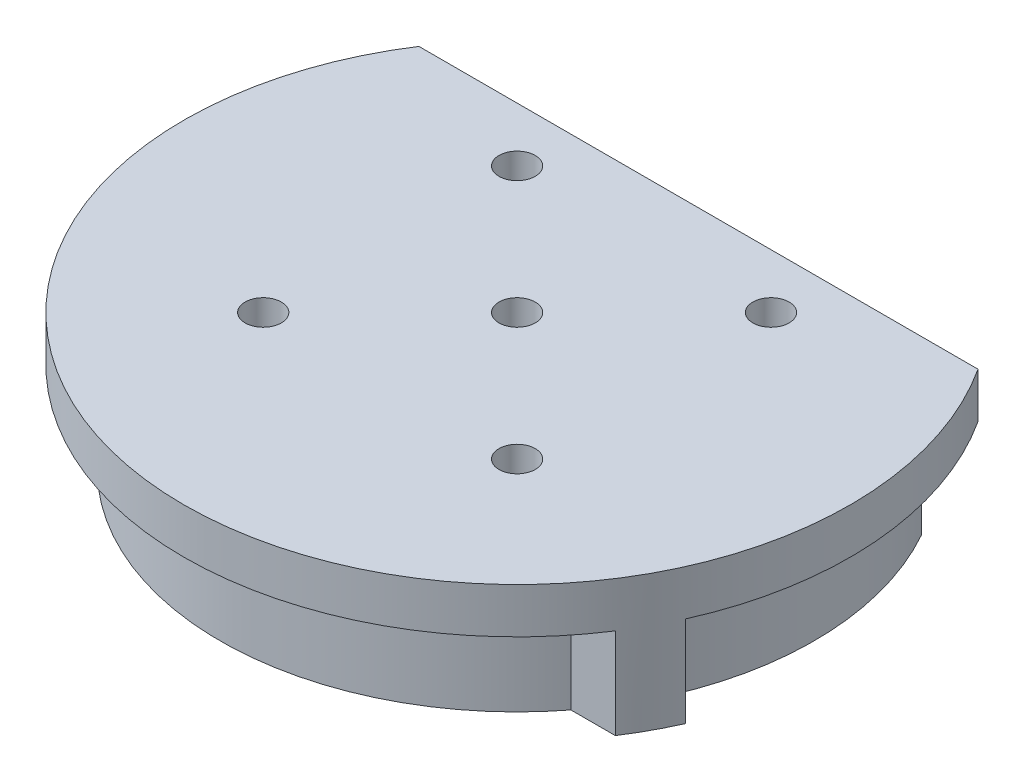
ISO-10303-21;
HEADER;
FILE_DESCRIPTION(('STEP AP214'),'2;1');
FILE_NAME('part.step','',(''),(''),'','','');
FILE_SCHEMA(('AUTOMOTIVE_DESIGN { 1 0 10303 214 1 1 1 1 }'));
ENDSEC;
DATA;
#1=APPLICATION_CONTEXT('core data for automotive mechanical design processes');
#2=APPLICATION_PROTOCOL_DEFINITION('international standard','automotive_design',2000,#1);
#3=PRODUCT_CONTEXT('',#1,'mechanical');
#4=PRODUCT('Part','Part','',(#3));
#5=PRODUCT_RELATED_PRODUCT_CATEGORY('part','',(#4));
#6=PRODUCT_DEFINITION_FORMATION('','',#4);
#7=PRODUCT_DEFINITION_CONTEXT('part definition',#1,'design');
#8=PRODUCT_DEFINITION('design','',#6,#7);
#9=PRODUCT_DEFINITION_SHAPE('','',#8);
#10=(LENGTH_UNIT() NAMED_UNIT(*) SI_UNIT(.MILLI.,.METRE.));
#11=(NAMED_UNIT(*) PLANE_ANGLE_UNIT() SI_UNIT($,.RADIAN.));
#12=(NAMED_UNIT(*) SI_UNIT($,.STERADIAN.) SOLID_ANGLE_UNIT());
#13=UNCERTAINTY_MEASURE_WITH_UNIT(LENGTH_MEASURE(1.E-05),#10,'distance_accuracy_value','');
#14=(GEOMETRIC_REPRESENTATION_CONTEXT(3) GLOBAL_UNCERTAINTY_ASSIGNED_CONTEXT((#13)) GLOBAL_UNIT_ASSIGNED_CONTEXT((#10,
#11,#12)) REPRESENTATION_CONTEXT('',''));
#15=CARTESIAN_POINT('',(0.,0.,0.));
#16=DIRECTION('',(0.,0.,1.));
#17=DIRECTION('',(1.,0.,0.));
#18=AXIS2_PLACEMENT_3D('',#15,#16,#17);
#19=CARTESIAN_POINT('',(0.,0.,0.));
#20=DIRECTION('',(0.,1.,0.));
#21=DIRECTION('',(0.,0.,1.));
#22=AXIS2_PLACEMENT_3D('',#19,#20,#21);
#23=PLANE('',#22);
#24=CARTESIAN_POINT('',(14.,0.,-14.));
#25=DIRECTION('',(0.,1.,0.));
#26=DIRECTION('',(0.,0.,1.));
#27=AXIS2_PLACEMENT_3D('',#24,#25,#26);
#28=CIRCLE('',#27,2.);
#29=CARTESIAN_POINT('',(14.,0.,-12.));
#30=VERTEX_POINT('',#29);
#31=EDGE_CURVE('E528',#30,#30,#28,.T.);
#32=ORIENTED_EDGE('',*,*,#31,.T.);
#33=EDGE_LOOP('',(#32));
#34=FACE_BOUND('',#33,.T.);
#35=CARTESIAN_POINT('',(-14.,0.,-14.));
#36=DIRECTION('',(0.,1.,0.));
#37=DIRECTION('',(0.,0.,1.));
#38=AXIS2_PLACEMENT_3D('',#35,#36,#37);
#39=CIRCLE('',#38,2.);
#40=CARTESIAN_POINT('',(-14.,0.,-12.));
#41=VERTEX_POINT('',#40);
#42=EDGE_CURVE('E532',#41,#41,#39,.T.);
#43=ORIENTED_EDGE('',*,*,#42,.T.);
#44=EDGE_LOOP('',(#43));
#45=FACE_BOUND('',#44,.T.);
#46=CARTESIAN_POINT('',(-14.,0.,14.));
#47=DIRECTION('',(0.,1.,0.));
#48=DIRECTION('',(0.,0.,1.));
#49=AXIS2_PLACEMENT_3D('',#46,#47,#48);
#50=CIRCLE('',#49,2.);
#51=CARTESIAN_POINT('',(-14.,0.,16.));
#52=VERTEX_POINT('',#51);
#53=EDGE_CURVE('E541',#52,#52,#50,.T.);
#54=ORIENTED_EDGE('',*,*,#53,.T.);
#55=EDGE_LOOP('',(#54));
#56=FACE_BOUND('',#55,.T.);
#57=CARTESIAN_POINT('',(14.,0.,14.));
#58=DIRECTION('',(0.,1.,0.));
#59=DIRECTION('',(0.,0.,1.));
#60=AXIS2_PLACEMENT_3D('',#57,#58,#59);
#61=CIRCLE('',#60,2.);
#62=CARTESIAN_POINT('',(14.,0.,16.));
#63=VERTEX_POINT('',#62);
#64=EDGE_CURVE('E169',#63,#63,#61,.T.);
#65=ORIENTED_EDGE('',*,*,#64,.T.);
#66=EDGE_LOOP('',(#65));
#67=FACE_BOUND('',#66,.T.);
#68=CARTESIAN_POINT('',(0.,0.,0.));
#69=DIRECTION('',(0.,1.,0.));
#70=DIRECTION('',(0.,0.,1.));
#71=AXIS2_PLACEMENT_3D('',#68,#69,#70);
#72=CIRCLE('',#71,7.5);
#73=CARTESIAN_POINT('',(0.,0.,7.5));
#74=VERTEX_POINT('',#73);
#75=EDGE_CURVE('E237',#74,#74,#72,.F.);
#76=ORIENTED_EDGE('',*,*,#75,.F.);
#77=EDGE_LOOP('',(#76));
#78=FACE_BOUND('',#77,.T.);
#79=DIRECTION('',(1.,0.,0.));
#80=VECTOR('',#79,1.);
#81=CARTESIAN_POINT('',(33.5494038695176,0.,15.));
#82=LINE('',#81,#80);
#83=CARTESIAN_POINT('',(29.1129266821459,0.,15.));
#84=VERTEX_POINT('',#83);
#85=CARTESIAN_POINT('',(33.5494038695176,0.,15.));
#86=VERTEX_POINT('',#85);
#87=EDGE_CURVE('E49',#84,#86,#82,.T.);
#88=ORIENTED_EDGE('',*,*,#87,.F.);
#89=CARTESIAN_POINT('',(0.,0.,0.));
#90=DIRECTION('',(0.,1.,0.));
#91=DIRECTION('',(0.,0.,1.));
#92=AXIS2_PLACEMENT_3D('',#89,#90,#91);
#93=CIRCLE('',#92,32.75);
#94=CARTESIAN_POINT('',(28.5755577373391,0.,-16.));
#95=VERTEX_POINT('',#94);
#96=EDGE_CURVE('E153',#84,#95,#93,.T.);
#97=ORIENTED_EDGE('',*,*,#96,.T.);
#98=DIRECTION('',(-1.,0.,0.));
#99=VECTOR('',#98,1.);
#100=CARTESIAN_POINT('',(28.5755577373391,0.,-16.));
#101=LINE('',#100,#99);
#102=CARTESIAN_POINT('',(23.8864501339148,0.,-16.));
#103=VERTEX_POINT('',#102);
#104=EDGE_CURVE('E203',#95,#103,#101,.T.);
#105=ORIENTED_EDGE('',*,*,#104,.T.);
#106=CARTESIAN_POINT('',(0.,0.,0.));
#107=DIRECTION('',(0.,1.,0.));
#108=DIRECTION('',(0.,0.,1.));
#109=AXIS2_PLACEMENT_3D('',#106,#107,#108);
#110=CIRCLE('',#109,28.75);
#111=CARTESIAN_POINT('',(-23.8864501339148,0.,-16.));
#112=VERTEX_POINT('',#111);
#113=EDGE_CURVE('E11',#112,#103,#110,.T.);
#114=ORIENTED_EDGE('',*,*,#113,.F.);
#115=DIRECTION('',(-1.,0.,0.));
#116=VECTOR('',#115,1.);
#117=CARTESIAN_POINT('',(-28.5755577373391,0.,-16.));
#118=LINE('',#117,#116);
#119=CARTESIAN_POINT('',(-28.5755577373391,0.,-16.));
#120=VERTEX_POINT('',#119);
#121=EDGE_CURVE('E213',#112,#120,#118,.T.);
#122=ORIENTED_EDGE('',*,*,#121,.T.);
#123=CARTESIAN_POINT('',(-29.1129266821459,0.,15.));
#124=VERTEX_POINT('',#123);
#125=EDGE_CURVE('E37',#120,#124,#93,.T.);
#126=ORIENTED_EDGE('',*,*,#125,.T.);
#127=DIRECTION('',(1.,0.,0.));
#128=VECTOR('',#127,1.);
#129=CARTESIAN_POINT('',(-33.5494038695176,0.,15.));
#130=LINE('',#129,#128);
#131=CARTESIAN_POINT('',(-33.5494038695176,0.,15.));
#132=VERTEX_POINT('',#131);
#133=EDGE_CURVE('E183',#132,#124,#130,.T.);
#134=ORIENTED_EDGE('',*,*,#133,.F.);
#135=CARTESIAN_POINT('',(0.,0.,0.));
#136=DIRECTION('',(0.,1.,0.));
#137=DIRECTION('',(0.,0.,1.));
#138=AXIS2_PLACEMENT_3D('',#135,#136,#137);
#139=CIRCLE('',#138,36.75);
#140=CARTESIAN_POINT('',(-30.8311936194498,0.,-20.));
#141=VERTEX_POINT('',#140);
#142=EDGE_CURVE('E238',#141,#132,#139,.T.);
#143=ORIENTED_EDGE('',*,*,#142,.F.);
#144=DIRECTION('',(-1.,0.,0.));
#145=VECTOR('',#144,1.);
#146=CARTESIAN_POINT('',(0.,0.,-20.));
#147=LINE('',#146,#145);
#148=CARTESIAN_POINT('',(30.8311936194498,0.,-20.));
#149=VERTEX_POINT('',#148);
#150=EDGE_CURVE('E228',#149,#141,#147,.T.);
#151=ORIENTED_EDGE('',*,*,#150,.F.);
#152=EDGE_CURVE('E242',#86,#149,#139,.T.);
#153=ORIENTED_EDGE('',*,*,#152,.F.);
#154=EDGE_LOOP('',(#88,#97,#105,#114,#122,#126,#134,#143,#151,#153));
#155=FACE_BOUND('',#154,.T.);
#156=ADVANCED_FACE('F33',(#34,#45,#56,#67,#78,#155),#23,.F.);
#157=DIRECTION('',(-1.,0.,0.));
#158=VECTOR('',#157,1.);
#159=CARTESIAN_POINT('',(30.8311936194498,0.,20.));
#160=LINE('',#159,#158);
#161=CARTESIAN_POINT('',(30.8311936194498,0.,20.));
#162=VERTEX_POINT('',#161);
#163=CARTESIAN_POINT('',(25.9338099784818,0.,20.));
#164=VERTEX_POINT('',#163);
#165=EDGE_CURVE('E162',#162,#164,#160,.T.);
#166=ORIENTED_EDGE('',*,*,#165,.F.);
#167=CARTESIAN_POINT('',(-30.8311936194498,0.,20.));
#168=VERTEX_POINT('',#167);
#169=EDGE_CURVE('E241',#168,#162,#139,.T.);
#170=ORIENTED_EDGE('',*,*,#169,.F.);
#171=DIRECTION('',(-1.,0.,0.));
#172=VECTOR('',#171,1.);
#173=CARTESIAN_POINT('',(-30.8311936194498,0.,20.));
#174=LINE('',#173,#172);
#175=CARTESIAN_POINT('',(-25.9338099784818,0.,20.));
#176=VERTEX_POINT('',#175);
#177=EDGE_CURVE('E155',#176,#168,#174,.T.);
#178=ORIENTED_EDGE('',*,*,#177,.F.);
#179=EDGE_CURVE('E317',#176,#164,#93,.T.);
#180=ORIENTED_EDGE('',*,*,#179,.T.);
#181=EDGE_LOOP('',(#166,#170,#178,#180));
#182=FACE_BOUND('',#181,.T.);
#183=ADVANCED_FACE('F256',(#182),#23,.F.);
#184=CARTESIAN_POINT('',(0.,-10.,0.));
#185=DIRECTION('',(0.,1.,0.));
#186=DIRECTION('',(0.,0.,1.));
#187=AXIS2_PLACEMENT_3D('',#184,#185,#186);
#188=CYLINDRICAL_SURFACE('',#187,32.75);
#189=ORIENTED_EDGE('',*,*,#96,.F.);
#190=DIRECTION('',(0.,1.,0.));
#191=VECTOR('',#190,1.);
#192=CARTESIAN_POINT('',(29.1129266821459,-10.,15.));
#193=LINE('',#192,#191);
#194=CARTESIAN_POINT('',(29.1129266821459,-10.,15.));
#195=VERTEX_POINT('',#194);
#196=EDGE_CURVE('E151',#195,#84,#193,.T.);
#197=ORIENTED_EDGE('',*,*,#196,.F.);
#198=CARTESIAN_POINT('',(0.,-10.,0.));
#199=DIRECTION('',(0.,1.,0.));
#200=DIRECTION('',(0.,0.,1.));
#201=AXIS2_PLACEMENT_3D('',#198,#199,#200);
#202=CIRCLE('',#201,32.75);
#203=CARTESIAN_POINT('',(28.5755577373391,-10.,-16.));
#204=VERTEX_POINT('',#203);
#205=EDGE_CURVE('E135',#195,#204,#202,.T.);
#206=ORIENTED_EDGE('',*,*,#205,.T.);
#207=DIRECTION('',(0.,-1.,0.));
#208=VECTOR('',#207,1.);
#209=CARTESIAN_POINT('',(28.5755577373391,0.,-16.));
#210=LINE('',#209,#208);
#211=EDGE_CURVE('E206',#95,#204,#210,.T.);
#212=ORIENTED_EDGE('',*,*,#211,.F.);
#213=EDGE_LOOP('',(#189,#197,#206,#212));
#214=FACE_BOUND('',#213,.T.);
#215=ADVANCED_FACE('F152',(#214),#188,.T.);
#216=CARTESIAN_POINT('',(-25.9338099784818,-10.,20.));
#217=VERTEX_POINT('',#216);
#218=CARTESIAN_POINT('',(25.9338099784818,-10.,20.));
#219=VERTEX_POINT('',#218);
#220=EDGE_CURVE('E146',#217,#219,#202,.T.);
#221=ORIENTED_EDGE('',*,*,#220,.T.);
#222=DIRECTION('',(0.,1.,0.));
#223=VECTOR('',#222,1.);
#224=CARTESIAN_POINT('',(25.9338099784818,-10.,20.));
#225=LINE('',#224,#223);
#226=EDGE_CURVE('E57',#219,#164,#225,.T.);
#227=ORIENTED_EDGE('',*,*,#226,.T.);
#228=ORIENTED_EDGE('',*,*,#179,.F.);
#229=DIRECTION('',(0.,1.,0.));
#230=VECTOR('',#229,1.);
#231=CARTESIAN_POINT('',(-25.9338099784818,-10.,20.));
#232=LINE('',#231,#230);
#233=EDGE_CURVE('E200',#217,#176,#232,.T.);
#234=ORIENTED_EDGE('',*,*,#233,.F.);
#235=EDGE_LOOP('',(#221,#227,#228,#234));
#236=FACE_BOUND('',#235,.T.);
#237=ADVANCED_FACE('F318',(#236),#188,.T.);
#238=CARTESIAN_POINT('',(-28.5755577373391,-10.,-16.));
#239=VERTEX_POINT('',#238);
#240=CARTESIAN_POINT('',(-29.1129266821459,-10.,15.));
#241=VERTEX_POINT('',#240);
#242=EDGE_CURVE('E149',#239,#241,#202,.T.);
#243=ORIENTED_EDGE('',*,*,#242,.T.);
#244=DIRECTION('',(0.,1.,0.));
#245=VECTOR('',#244,1.);
#246=CARTESIAN_POINT('',(-29.1129266821459,-10.,15.));
#247=LINE('',#246,#245);
#248=EDGE_CURVE('E188',#241,#124,#247,.T.);
#249=ORIENTED_EDGE('',*,*,#248,.T.);
#250=ORIENTED_EDGE('',*,*,#125,.F.);
#251=DIRECTION('',(0.,-1.,0.));
#252=VECTOR('',#251,1.);
#253=CARTESIAN_POINT('',(-28.5755577373391,0.,-16.));
#254=LINE('',#253,#252);
#255=EDGE_CURVE('E215',#120,#239,#254,.T.);
#256=ORIENTED_EDGE('',*,*,#255,.T.);
#257=EDGE_LOOP('',(#243,#249,#250,#256));
#258=FACE_BOUND('',#257,.T.);
#259=ADVANCED_FACE('F329',(#258),#188,.T.);
#260=CARTESIAN_POINT('',(-30.8311936194498,10.,-20.));
#261=DIRECTION('',(0.,0.,-1.));
#262=DIRECTION('',(-1.,0.,0.));
#263=AXIS2_PLACEMENT_3D('',#260,#261,#262);
#264=PLANE('',#263);
#265=DIRECTION('',(0.,-1.,0.));
#266=VECTOR('',#265,1.);
#267=CARTESIAN_POINT('',(30.8311936194498,10.,-20.));
#268=LINE('',#267,#266);
#269=CARTESIAN_POINT('',(30.8311936194498,5.,-20.));
#270=VERTEX_POINT('',#269);
#271=EDGE_CURVE('E222',#270,#149,#268,.T.);
#272=ORIENTED_EDGE('',*,*,#271,.T.);
#273=ORIENTED_EDGE('',*,*,#150,.T.);
#274=DIRECTION('',(0.,-1.,0.));
#275=VECTOR('',#274,1.);
#276=CARTESIAN_POINT('',(-30.8311936194498,10.,-20.));
#277=LINE('',#276,#275);
#278=CARTESIAN_POINT('',(-30.8311936194498,5.,-20.));
#279=VERTEX_POINT('',#278);
#280=EDGE_CURVE('E225',#279,#141,#277,.T.);
#281=ORIENTED_EDGE('',*,*,#280,.F.);
#282=DIRECTION('',(-1.,0.,0.));
#283=VECTOR('',#282,1.);
#284=CARTESIAN_POINT('',(0.,5.,-20.));
#285=LINE('',#284,#283);
#286=EDGE_CURVE('E230',#270,#279,#285,.T.);
#287=ORIENTED_EDGE('',*,*,#286,.F.);
#288=EDGE_LOOP('',(#272,#273,#281,#287));
#289=FACE_BOUND('',#288,.T.);
#290=ADVANCED_FACE('F276',(#289),#264,.T.);
#291=CARTESIAN_POINT('',(0.,5.,0.));
#292=DIRECTION('',(0.,1.,0.));
#293=DIRECTION('',(0.,0.,1.));
#294=AXIS2_PLACEMENT_3D('',#291,#292,#293);
#295=PLANE('',#294);
#296=CARTESIAN_POINT('',(14.,5.,-14.));
#297=DIRECTION('',(0.,1.,0.));
#298=DIRECTION('',(0.,0.,1.));
#299=AXIS2_PLACEMENT_3D('',#296,#297,#298);
#300=CIRCLE('',#299,2.);
#301=CARTESIAN_POINT('',(14.,5.,-12.));
#302=VERTEX_POINT('',#301);
#303=EDGE_CURVE('E526',#302,#302,#300,.T.);
#304=ORIENTED_EDGE('',*,*,#303,.F.);
#305=EDGE_LOOP('',(#304));
#306=FACE_BOUND('',#305,.T.);
#307=CARTESIAN_POINT('',(-14.,5.,-14.));
#308=DIRECTION('',(0.,1.,0.));
#309=DIRECTION('',(0.,0.,1.));
#310=AXIS2_PLACEMENT_3D('',#307,#308,#309);
#311=CIRCLE('',#310,2.);
#312=CARTESIAN_POINT('',(-14.,5.,-12.));
#313=VERTEX_POINT('',#312);
#314=EDGE_CURVE('E529',#313,#313,#311,.T.);
#315=ORIENTED_EDGE('',*,*,#314,.F.);
#316=EDGE_LOOP('',(#315));
#317=FACE_BOUND('',#316,.T.);
#318=CARTESIAN_POINT('',(-14.,5.,14.));
#319=DIRECTION('',(0.,1.,0.));
#320=DIRECTION('',(0.,0.,1.));
#321=AXIS2_PLACEMENT_3D('',#318,#319,#320);
#322=CIRCLE('',#321,2.);
#323=CARTESIAN_POINT('',(-14.,5.,16.));
#324=VERTEX_POINT('',#323);
#325=EDGE_CURVE('E538',#324,#324,#322,.T.);
#326=ORIENTED_EDGE('',*,*,#325,.F.);
#327=EDGE_LOOP('',(#326));
#328=FACE_BOUND('',#327,.T.);
#329=CARTESIAN_POINT('',(14.,5.,14.));
#330=DIRECTION('',(0.,1.,0.));
#331=DIRECTION('',(0.,0.,1.));
#332=AXIS2_PLACEMENT_3D('',#329,#330,#331);
#333=CIRCLE('',#332,2.);
#334=CARTESIAN_POINT('',(14.,5.,16.));
#335=VERTEX_POINT('',#334);
#336=EDGE_CURVE('E543',#335,#335,#333,.T.);
#337=ORIENTED_EDGE('',*,*,#336,.F.);
#338=EDGE_LOOP('',(#337));
#339=FACE_BOUND('',#338,.T.);
#340=CARTESIAN_POINT('',(0.,5.,0.));
#341=DIRECTION('',(0.,1.,0.));
#342=DIRECTION('',(0.,0.,1.));
#343=AXIS2_PLACEMENT_3D('',#340,#341,#342);
#344=CIRCLE('',#343,2.);
#345=CARTESIAN_POINT('',(0.,5.,2.));
#346=VERTEX_POINT('',#345);
#347=EDGE_CURVE('E243',#346,#346,#344,.T.);
#348=ORIENTED_EDGE('',*,*,#347,.F.);
#349=EDGE_LOOP('',(#348));
#350=FACE_BOUND('',#349,.T.);
#351=CARTESIAN_POINT('',(0.,5.,0.));
#352=DIRECTION('',(0.,1.,0.));
#353=DIRECTION('',(0.,0.,1.));
#354=AXIS2_PLACEMENT_3D('',#351,#352,#353);
#355=CIRCLE('',#354,36.75);
#356=EDGE_CURVE('E234',#279,#270,#355,.T.);
#357=ORIENTED_EDGE('',*,*,#356,.T.);
#358=ORIENTED_EDGE('',*,*,#286,.T.);
#359=EDGE_LOOP('',(#357,#358));
#360=FACE_BOUND('',#359,.T.);
#361=ADVANCED_FACE('F272',(#306,#317,#328,#339,#350,#360),#295,.T.);
#362=CARTESIAN_POINT('',(0.,5.,0.));
#363=DIRECTION('',(0.,-1.,0.));
#364=DIRECTION('',(0.,0.,-1.));
#365=AXIS2_PLACEMENT_3D('',#362,#363,#364);
#366=CYLINDRICAL_SURFACE('',#365,36.75);
#367=ORIENTED_EDGE('',*,*,#280,.T.);
#368=ORIENTED_EDGE('',*,*,#142,.T.);
#369=DIRECTION('',(0.,1.,0.));
#370=VECTOR('',#369,1.);
#371=CARTESIAN_POINT('',(-33.5494038695176,-10.,15.));
#372=LINE('',#371,#370);
#373=CARTESIAN_POINT('',(-33.5494038695176,-10.,15.));
#374=VERTEX_POINT('',#373);
#375=EDGE_CURVE('E194',#374,#132,#372,.T.);
#376=ORIENTED_EDGE('',*,*,#375,.F.);
#377=CARTESIAN_POINT('',(0.,-10.,0.));
#378=DIRECTION('',(0.,-1.,0.));
#379=DIRECTION('',(0.,0.,1.));
#380=AXIS2_PLACEMENT_3D('',#377,#378,#379);
#381=CIRCLE('',#380,36.75);
#382=CARTESIAN_POINT('',(-30.8311936194498,-10.,20.));
#383=VERTEX_POINT('',#382);
#384=EDGE_CURVE('E182',#383,#374,#381,.T.);
#385=ORIENTED_EDGE('',*,*,#384,.F.);
#386=DIRECTION('',(0.,1.,0.));
#387=VECTOR('',#386,1.);
#388=CARTESIAN_POINT('',(-30.8311936194498,-10.,20.));
#389=LINE('',#388,#387);
#390=EDGE_CURVE('E197',#383,#168,#389,.T.);
#391=ORIENTED_EDGE('',*,*,#390,.T.);
#392=ORIENTED_EDGE('',*,*,#169,.T.);
#393=DIRECTION('',(0.,1.,0.));
#394=VECTOR('',#393,1.);
#395=CARTESIAN_POINT('',(30.8311936194498,-10.,20.));
#396=LINE('',#395,#394);
#397=CARTESIAN_POINT('',(30.8311936194498,-10.,20.));
#398=VERTEX_POINT('',#397);
#399=EDGE_CURVE('E176',#398,#162,#396,.T.);
#400=ORIENTED_EDGE('',*,*,#399,.F.);
#401=CARTESIAN_POINT('',(0.,-10.,0.));
#402=DIRECTION('',(0.,-1.,0.));
#403=DIRECTION('',(0.,0.,-1.));
#404=AXIS2_PLACEMENT_3D('',#401,#402,#403);
#405=CIRCLE('',#404,36.75);
#406=CARTESIAN_POINT('',(33.5494038695176,-10.,15.));
#407=VERTEX_POINT('',#406);
#408=EDGE_CURVE('E161',#407,#398,#405,.T.);
#409=ORIENTED_EDGE('',*,*,#408,.F.);
#410=DIRECTION('',(0.,1.,0.));
#411=VECTOR('',#410,1.);
#412=CARTESIAN_POINT('',(33.5494038695176,-10.,15.));
#413=LINE('',#412,#411);
#414=EDGE_CURVE('E156',#407,#86,#413,.T.);
#415=ORIENTED_EDGE('',*,*,#414,.T.);
#416=ORIENTED_EDGE('',*,*,#152,.T.);
#417=ORIENTED_EDGE('',*,*,#271,.F.);
#418=ORIENTED_EDGE('',*,*,#356,.F.);
#419=EDGE_LOOP('',(#367,#368,#376,#385,#391,#392,#400,#409,#415,#416,#417,#418));
#420=FACE_BOUND('',#419,.T.);
#421=ADVANCED_FACE('F268',(#420),#366,.T.);
#422=CARTESIAN_POINT('',(0.,-10.,0.));
#423=DIRECTION('',(0.,1.,0.));
#424=DIRECTION('',(0.,0.,1.));
#425=AXIS2_PLACEMENT_3D('',#422,#423,#424);
#426=CYLINDRICAL_SURFACE('',#425,28.75);
#427=ORIENTED_EDGE('',*,*,#113,.T.);
#428=DIRECTION('',(0.,1.,0.));
#429=VECTOR('',#428,1.);
#430=CARTESIAN_POINT('',(23.8864501339148,-10.,-16.));
#431=LINE('',#430,#429);
#432=CARTESIAN_POINT('',(23.8864501339148,-10.,-16.));
#433=VERTEX_POINT('',#432);
#434=EDGE_CURVE('E209',#103,#433,#431,.F.);
#435=ORIENTED_EDGE('',*,*,#434,.T.);
#436=CARTESIAN_POINT('',(0.,-10.,0.));
#437=DIRECTION('',(0.,1.,0.));
#438=DIRECTION('',(0.,0.,1.));
#439=AXIS2_PLACEMENT_3D('',#436,#437,#438);
#440=CIRCLE('',#439,28.75);
#441=CARTESIAN_POINT('',(-23.8864501339148,-10.,-16.));
#442=VERTEX_POINT('',#441);
#443=EDGE_CURVE('E147',#442,#433,#440,.T.);
#444=ORIENTED_EDGE('',*,*,#443,.F.);
#445=DIRECTION('',(0.,1.,0.));
#446=VECTOR('',#445,1.);
#447=CARTESIAN_POINT('',(-23.8864501339148,-10.,-16.));
#448=LINE('',#447,#446);
#449=EDGE_CURVE('E219',#442,#112,#448,.T.);
#450=ORIENTED_EDGE('',*,*,#449,.T.);
#451=EDGE_LOOP('',(#427,#435,#444,#450));
#452=FACE_BOUND('',#451,.T.);
#453=ADVANCED_FACE('F271',(#452),#426,.F.);
#454=CARTESIAN_POINT('',(0.,-10.,0.));
#455=DIRECTION('',(0.,1.,0.));
#456=DIRECTION('',(0.,0.,1.));
#457=AXIS2_PLACEMENT_3D('',#454,#455,#456);
#458=PLANE('',#457);
#459=ORIENTED_EDGE('',*,*,#443,.T.);
#460=DIRECTION('',(-1.,0.,0.));
#461=VECTOR('',#460,1.);
#462=CARTESIAN_POINT('',(28.5755577373391,-10.,-16.));
#463=LINE('',#462,#461);
#464=EDGE_CURVE('E142',#204,#433,#463,.T.);
#465=ORIENTED_EDGE('',*,*,#464,.F.);
#466=ORIENTED_EDGE('',*,*,#205,.F.);
#467=DIRECTION('',(1.,0.,0.));
#468=VECTOR('',#467,1.);
#469=CARTESIAN_POINT('',(33.5494038695176,-10.,15.));
#470=LINE('',#469,#468);
#471=EDGE_CURVE('E140',#195,#407,#470,.T.);
#472=ORIENTED_EDGE('',*,*,#471,.T.);
#473=ORIENTED_EDGE('',*,*,#408,.T.);
#474=DIRECTION('',(-1.,0.,0.));
#475=VECTOR('',#474,1.);
#476=CARTESIAN_POINT('',(30.8311936194498,-10.,20.));
#477=LINE('',#476,#475);
#478=EDGE_CURVE('E164',#398,#219,#477,.T.);
#479=ORIENTED_EDGE('',*,*,#478,.T.);
#480=ORIENTED_EDGE('',*,*,#220,.F.);
#481=DIRECTION('',(-1.,0.,0.));
#482=VECTOR('',#481,1.);
#483=CARTESIAN_POINT('',(-30.8311936194498,-10.,20.));
#484=LINE('',#483,#482);
#485=EDGE_CURVE('E180',#217,#383,#484,.T.);
#486=ORIENTED_EDGE('',*,*,#485,.T.);
#487=ORIENTED_EDGE('',*,*,#384,.T.);
#488=DIRECTION('',(1.,0.,0.));
#489=VECTOR('',#488,1.);
#490=CARTESIAN_POINT('',(-33.5494038695176,-10.,15.));
#491=LINE('',#490,#489);
#492=EDGE_CURVE('E185',#374,#241,#491,.T.);
#493=ORIENTED_EDGE('',*,*,#492,.T.);
#494=ORIENTED_EDGE('',*,*,#242,.F.);
#495=DIRECTION('',(-1.,0.,0.));
#496=VECTOR('',#495,1.);
#497=CARTESIAN_POINT('',(-28.5755577373391,-10.,-16.));
#498=LINE('',#497,#496);
#499=EDGE_CURVE('E212',#442,#239,#498,.T.);
#500=ORIENTED_EDGE('',*,*,#499,.F.);
#501=EDGE_LOOP('',(#459,#465,#466,#472,#473,#479,#480,#486,#487,#493,#494,#500));
#502=FACE_BOUND('',#501,.T.);
#503=ADVANCED_FACE('F138',(#502),#458,.F.);
#504=CARTESIAN_POINT('',(0.,-10.,0.));
#505=DIRECTION('',(0.,1.,0.));
#506=DIRECTION('',(0.,0.,1.));
#507=AXIS2_PLACEMENT_3D('',#504,#505,#506);
#508=CYLINDRICAL_SURFACE('',#507,7.5);
#509=CARTESIAN_POINT('',(0.,-10.,0.));
#510=DIRECTION('',(0.,1.,0.));
#511=DIRECTION('',(0.,0.,1.));
#512=AXIS2_PLACEMENT_3D('',#509,#510,#511);
#513=CIRCLE('',#512,7.5);
#514=CARTESIAN_POINT('',(0.,-10.,7.5));
#515=VERTEX_POINT('',#514);
#516=EDGE_CURVE('E42',#515,#515,#513,.T.);
#517=ORIENTED_EDGE('',*,*,#516,.T.);
#518=EDGE_LOOP('',(#517));
#519=FACE_BOUND('',#518,.T.);
#520=ORIENTED_EDGE('',*,*,#75,.T.);
#521=EDGE_LOOP('',(#520));
#522=FACE_BOUND('',#521,.T.);
#523=ADVANCED_FACE('F35',(#519,#522),#508,.T.);
#524=CARTESIAN_POINT('',(0.,-10.,0.));
#525=DIRECTION('',(0.,1.,0.));
#526=DIRECTION('',(0.,0.,1.));
#527=AXIS2_PLACEMENT_3D('',#524,#525,#526);
#528=PLANE('',#527);
#529=CARTESIAN_POINT('',(0.,-10.,0.));
#530=DIRECTION('',(0.,1.,0.));
#531=DIRECTION('',(0.,0.,1.));
#532=AXIS2_PLACEMENT_3D('',#529,#530,#531);
#533=CIRCLE('',#532,2.);
#534=CARTESIAN_POINT('',(0.,-10.,2.));
#535=VERTEX_POINT('',#534);
#536=EDGE_CURVE('E246',#535,#535,#533,.T.);
#537=ORIENTED_EDGE('',*,*,#536,.T.);
#538=EDGE_LOOP('',(#537));
#539=FACE_BOUND('',#538,.T.);
#540=ORIENTED_EDGE('',*,*,#516,.F.);
#541=EDGE_LOOP('',(#540));
#542=FACE_BOUND('',#541,.T.);
#543=ADVANCED_FACE('F281',(#539,#542),#528,.F.);
#544=CARTESIAN_POINT('',(0.,-10.,0.));
#545=DIRECTION('',(0.,1.,0.));
#546=DIRECTION('',(0.,0.,1.));
#547=AXIS2_PLACEMENT_3D('',#544,#545,#546);
#548=CYLINDRICAL_SURFACE('',#547,2.);
#549=ORIENTED_EDGE('',*,*,#536,.F.);
#550=EDGE_LOOP('',(#549));
#551=FACE_BOUND('',#550,.T.);
#552=ORIENTED_EDGE('',*,*,#347,.T.);
#553=EDGE_LOOP('',(#552));
#554=FACE_BOUND('',#553,.T.);
#555=ADVANCED_FACE('F278',(#551,#554),#548,.F.);
#556=CARTESIAN_POINT('',(-28.5755577373391,0.,-16.));
#557=DIRECTION('',(0.,0.,1.));
#558=DIRECTION('',(1.,0.,0.));
#559=AXIS2_PLACEMENT_3D('',#556,#557,#558);
#560=PLANE('',#559);
#561=ORIENTED_EDGE('',*,*,#499,.T.);
#562=ORIENTED_EDGE('',*,*,#255,.F.);
#563=ORIENTED_EDGE('',*,*,#121,.F.);
#564=ORIENTED_EDGE('',*,*,#449,.F.);
#565=EDGE_LOOP('',(#561,#562,#563,#564));
#566=FACE_BOUND('',#565,.T.);
#567=ADVANCED_FACE('F280',(#566),#560,.F.);
#568=CARTESIAN_POINT('',(28.5755577373391,0.,-16.));
#569=DIRECTION('',(0.,0.,1.));
#570=DIRECTION('',(1.,0.,0.));
#571=AXIS2_PLACEMENT_3D('',#568,#569,#570);
#572=PLANE('',#571);
#573=ORIENTED_EDGE('',*,*,#104,.F.);
#574=ORIENTED_EDGE('',*,*,#211,.T.);
#575=ORIENTED_EDGE('',*,*,#464,.T.);
#576=ORIENTED_EDGE('',*,*,#434,.F.);
#577=EDGE_LOOP('',(#573,#574,#575,#576));
#578=FACE_BOUND('',#577,.T.);
#579=ADVANCED_FACE('F322',(#578),#572,.F.);
#580=CARTESIAN_POINT('',(-30.8311936194498,-10.,20.));
#581=DIRECTION('',(0.,0.,-1.));
#582=DIRECTION('',(-1.,0.,0.));
#583=AXIS2_PLACEMENT_3D('',#580,#581,#582);
#584=PLANE('',#583);
#585=ORIENTED_EDGE('',*,*,#177,.T.);
#586=ORIENTED_EDGE('',*,*,#390,.F.);
#587=ORIENTED_EDGE('',*,*,#485,.F.);
#588=ORIENTED_EDGE('',*,*,#233,.T.);
#589=EDGE_LOOP('',(#585,#586,#587,#588));
#590=FACE_BOUND('',#589,.T.);
#591=ADVANCED_FACE('F315',(#590),#584,.F.);
#592=CARTESIAN_POINT('',(-33.5494038695176,-10.,15.));
#593=DIRECTION('',(0.,0.,1.));
#594=DIRECTION('',(1.,0.,0.));
#595=AXIS2_PLACEMENT_3D('',#592,#593,#594);
#596=PLANE('',#595);
#597=ORIENTED_EDGE('',*,*,#133,.T.);
#598=ORIENTED_EDGE('',*,*,#248,.F.);
#599=ORIENTED_EDGE('',*,*,#492,.F.);
#600=ORIENTED_EDGE('',*,*,#375,.T.);
#601=EDGE_LOOP('',(#597,#598,#599,#600));
#602=FACE_BOUND('',#601,.T.);
#603=ADVANCED_FACE('F306',(#602),#596,.F.);
#604=CARTESIAN_POINT('',(33.5494038695176,-10.,15.));
#605=DIRECTION('',(0.,0.,1.));
#606=DIRECTION('',(1.,0.,0.));
#607=AXIS2_PLACEMENT_3D('',#604,#605,#606);
#608=PLANE('',#607);
#609=ORIENTED_EDGE('',*,*,#87,.T.);
#610=ORIENTED_EDGE('',*,*,#414,.F.);
#611=ORIENTED_EDGE('',*,*,#471,.F.);
#612=ORIENTED_EDGE('',*,*,#196,.T.);
#613=EDGE_LOOP('',(#609,#610,#611,#612));
#614=FACE_BOUND('',#613,.T.);
#615=ADVANCED_FACE('F158',(#614),#608,.F.);
#616=CARTESIAN_POINT('',(30.8311936194498,-10.,20.));
#617=DIRECTION('',(0.,0.,-1.));
#618=DIRECTION('',(-1.,0.,0.));
#619=AXIS2_PLACEMENT_3D('',#616,#617,#618);
#620=PLANE('',#619);
#621=ORIENTED_EDGE('',*,*,#165,.T.);
#622=ORIENTED_EDGE('',*,*,#226,.F.);
#623=ORIENTED_EDGE('',*,*,#478,.F.);
#624=ORIENTED_EDGE('',*,*,#399,.T.);
#625=EDGE_LOOP('',(#621,#622,#623,#624));
#626=FACE_BOUND('',#625,.T.);
#627=ADVANCED_FACE('F392',(#626),#620,.F.);
#628=CARTESIAN_POINT('',(14.,-5.,14.));
#629=DIRECTION('',(0.,1.,0.));
#630=DIRECTION('',(0.,0.,1.));
#631=AXIS2_PLACEMENT_3D('',#628,#629,#630);
#632=CYLINDRICAL_SURFACE('',#631,2.);
#633=ORIENTED_EDGE('',*,*,#336,.T.);
#634=EDGE_LOOP('',(#633));
#635=FACE_BOUND('',#634,.T.);
#636=ORIENTED_EDGE('',*,*,#64,.F.);
#637=EDGE_LOOP('',(#636));
#638=FACE_BOUND('',#637,.T.);
#639=ADVANCED_FACE('F400',(#635,#638),#632,.F.);
#640=CARTESIAN_POINT('',(-14.,-5.,14.));
#641=DIRECTION('',(0.,1.,0.));
#642=DIRECTION('',(0.,0.,1.));
#643=AXIS2_PLACEMENT_3D('',#640,#641,#642);
#644=CYLINDRICAL_SURFACE('',#643,2.);
#645=ORIENTED_EDGE('',*,*,#325,.T.);
#646=EDGE_LOOP('',(#645));
#647=FACE_BOUND('',#646,.T.);
#648=ORIENTED_EDGE('',*,*,#53,.F.);
#649=EDGE_LOOP('',(#648));
#650=FACE_BOUND('',#649,.T.);
#651=ADVANCED_FACE('F424',(#647,#650),#644,.F.);
#652=CARTESIAN_POINT('',(-14.,-5.,-14.));
#653=DIRECTION('',(0.,1.,0.));
#654=DIRECTION('',(0.,0.,1.));
#655=AXIS2_PLACEMENT_3D('',#652,#653,#654);
#656=CYLINDRICAL_SURFACE('',#655,2.);
#657=ORIENTED_EDGE('',*,*,#314,.T.);
#658=EDGE_LOOP('',(#657));
#659=FACE_BOUND('',#658,.T.);
#660=ORIENTED_EDGE('',*,*,#42,.F.);
#661=EDGE_LOOP('',(#660));
#662=FACE_BOUND('',#661,.T.);
#663=ADVANCED_FACE('F434',(#659,#662),#656,.F.);
#664=CARTESIAN_POINT('',(14.,-5.,-14.));
#665=DIRECTION('',(0.,1.,0.));
#666=DIRECTION('',(0.,0.,1.));
#667=AXIS2_PLACEMENT_3D('',#664,#665,#666);
#668=CYLINDRICAL_SURFACE('',#667,2.);
#669=ORIENTED_EDGE('',*,*,#303,.T.);
#670=EDGE_LOOP('',(#669));
#671=FACE_BOUND('',#670,.T.);
#672=ORIENTED_EDGE('',*,*,#31,.F.);
#673=EDGE_LOOP('',(#672));
#674=FACE_BOUND('',#673,.T.);
#675=ADVANCED_FACE('F444',(#671,#674),#668,.F.);
#676=CLOSED_SHELL('',(#156,#183,#215,#237,#259,#290,#361,#421,#453,#503,#523,#543,#555,#567,
#579,#591,#603,#615,#627,#639,#651,#663,#675));
#677=MANIFOLD_SOLID_BREP('B2',#676);
#678=ADVANCED_BREP_SHAPE_REPRESENTATION('',(#18,#677),#14);
#679=SHAPE_DEFINITION_REPRESENTATION(#9,#678);
ENDSEC;
END-ISO-10303-21;
